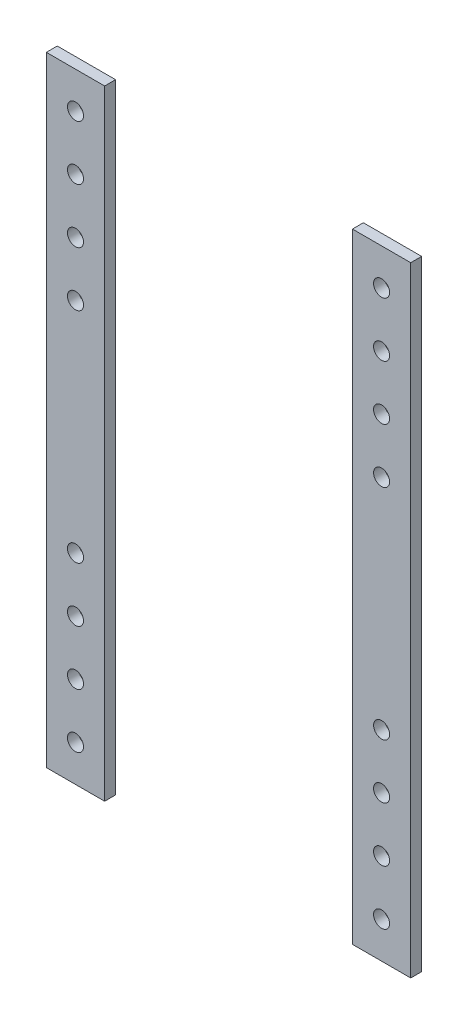
ISO-10303-21;
HEADER;
FILE_DESCRIPTION(('STEP AP214'),'2;1');
FILE_NAME('part.step','',(''),(''),'','','');
FILE_SCHEMA(('AUTOMOTIVE_DESIGN { 1 0 10303 214 1 1 1 1 }'));
ENDSEC;
DATA;
#1=APPLICATION_CONTEXT('core data for automotive mechanical design processes');
#2=APPLICATION_PROTOCOL_DEFINITION('international standard','automotive_design',2000,#1);
#3=PRODUCT_CONTEXT('',#1,'mechanical');
#4=PRODUCT('Part','Part','',(#3));
#5=PRODUCT_RELATED_PRODUCT_CATEGORY('part','',(#4));
#6=PRODUCT_DEFINITION_FORMATION('','',#4);
#7=PRODUCT_DEFINITION_CONTEXT('part definition',#1,'design');
#8=PRODUCT_DEFINITION('design','',#6,#7);
#9=PRODUCT_DEFINITION_SHAPE('','',#8);
#10=(LENGTH_UNIT() NAMED_UNIT(*) SI_UNIT(.MILLI.,.METRE.));
#11=(NAMED_UNIT(*) PLANE_ANGLE_UNIT() SI_UNIT($,.RADIAN.));
#12=(NAMED_UNIT(*) SI_UNIT($,.STERADIAN.) SOLID_ANGLE_UNIT());
#13=UNCERTAINTY_MEASURE_WITH_UNIT(LENGTH_MEASURE(1.E-05),#10,'distance_accuracy_value','');
#14=(GEOMETRIC_REPRESENTATION_CONTEXT(3) GLOBAL_UNCERTAINTY_ASSIGNED_CONTEXT((#13)) GLOBAL_UNIT_ASSIGNED_CONTEXT((#10,
#11,#12)) REPRESENTATION_CONTEXT('',''));
#15=CARTESIAN_POINT('',(0.,0.,0.));
#16=DIRECTION('',(0.,0.,1.));
#17=DIRECTION('',(1.,0.,0.));
#18=AXIS2_PLACEMENT_3D('',#15,#16,#17);
#19=CARTESIAN_POINT('',(0.,0.,-1589.05000079646));
#20=DIRECTION('',(0.,0.,-1.));
#21=DIRECTION('',(-1.,0.,0.));
#22=AXIS2_PLACEMENT_3D('',#19,#20,#21);
#23=PLANE('',#22);
#24=CARTESIAN_POINT('',(42.,760.,-1589.05000079646));
#25=DIRECTION('',(0.,0.,1.));
#26=DIRECTION('',(1.,0.,0.));
#27=AXIS2_PLACEMENT_3D('',#24,#25,#26);
#28=CIRCLE('',#27,2.19999999999997);
#29=CARTESIAN_POINT('',(44.2,760.,-1589.05000079646));
#30=VERTEX_POINT('',#29);
#31=EDGE_CURVE('E411',#30,#30,#28,.T.);
#32=ORIENTED_EDGE('',*,*,#31,.F.);
#33=EDGE_LOOP('',(#32));
#34=FACE_BOUND('',#33,.T.);
#35=CARTESIAN_POINT('',(42.,820.,-1589.05000079646));
#36=DIRECTION('',(0.,0.,1.));
#37=DIRECTION('',(1.,0.,0.));
#38=AXIS2_PLACEMENT_3D('',#35,#36,#37);
#39=CIRCLE('',#38,2.19999999999997);
#40=CARTESIAN_POINT('',(44.2,820.,-1589.05000079646));
#41=VERTEX_POINT('',#40);
#42=EDGE_CURVE('E415',#41,#41,#39,.T.);
#43=ORIENTED_EDGE('',*,*,#42,.F.);
#44=EDGE_LOOP('',(#43));
#45=FACE_BOUND('',#44,.T.);
#46=CARTESIAN_POINT('',(42.,865.,-1589.05000079646));
#47=DIRECTION('',(0.,0.,1.));
#48=DIRECTION('',(1.,0.,0.));
#49=AXIS2_PLACEMENT_3D('',#46,#47,#48);
#50=CIRCLE('',#49,2.19999999999996);
#51=CARTESIAN_POINT('',(44.2,865.,-1589.05000079646));
#52=VERTEX_POINT('',#51);
#53=EDGE_CURVE('E424',#52,#52,#50,.T.);
#54=ORIENTED_EDGE('',*,*,#53,.F.);
#55=EDGE_LOOP('',(#54));
#56=FACE_BOUND('',#55,.T.);
#57=CARTESIAN_POINT('',(42.,850.,-1589.05000079646));
#58=DIRECTION('',(0.,0.,1.));
#59=DIRECTION('',(1.,0.,0.));
#60=AXIS2_PLACEMENT_3D('',#57,#58,#59);
#61=CIRCLE('',#60,2.19999999999996);
#62=CARTESIAN_POINT('',(44.2,850.,-1589.05000079646));
#63=VERTEX_POINT('',#62);
#64=EDGE_CURVE('E430',#63,#63,#61,.T.);
#65=ORIENTED_EDGE('',*,*,#64,.F.);
#66=EDGE_LOOP('',(#65));
#67=FACE_BOUND('',#66,.T.);
#68=CARTESIAN_POINT('',(42.,835.,-1589.05000079646));
#69=DIRECTION('',(0.,0.,1.));
#70=DIRECTION('',(1.,0.,0.));
#71=AXIS2_PLACEMENT_3D('',#68,#69,#70);
#72=CIRCLE('',#71,2.19999999999996);
#73=CARTESIAN_POINT('',(44.2,835.,-1589.05000079646));
#74=VERTEX_POINT('',#73);
#75=EDGE_CURVE('E436',#74,#74,#72,.T.);
#76=ORIENTED_EDGE('',*,*,#75,.F.);
#77=EDGE_LOOP('',(#76));
#78=FACE_BOUND('',#77,.T.);
#79=CARTESIAN_POINT('',(42.,745.,-1589.05000079646));
#80=DIRECTION('',(0.,0.,1.));
#81=DIRECTION('',(1.,0.,0.));
#82=AXIS2_PLACEMENT_3D('',#79,#80,#81);
#83=CIRCLE('',#82,2.19999999999996);
#84=CARTESIAN_POINT('',(44.2,745.,-1589.05000079646));
#85=VERTEX_POINT('',#84);
#86=EDGE_CURVE('E442',#85,#85,#83,.T.);
#87=ORIENTED_EDGE('',*,*,#86,.F.);
#88=EDGE_LOOP('',(#87));
#89=FACE_BOUND('',#88,.T.);
#90=CARTESIAN_POINT('',(42.,730.,-1589.05000079646));
#91=DIRECTION('',(0.,0.,1.));
#92=DIRECTION('',(1.,0.,0.));
#93=AXIS2_PLACEMENT_3D('',#90,#91,#92);
#94=CIRCLE('',#93,2.19999999999996);
#95=CARTESIAN_POINT('',(44.2,730.,-1589.05000079646));
#96=VERTEX_POINT('',#95);
#97=EDGE_CURVE('E448',#96,#96,#94,.T.);
#98=ORIENTED_EDGE('',*,*,#97,.F.);
#99=EDGE_LOOP('',(#98));
#100=FACE_BOUND('',#99,.T.);
#101=CARTESIAN_POINT('',(42.,715.,-1589.05000079646));
#102=DIRECTION('',(0.,0.,1.));
#103=DIRECTION('',(1.,0.,0.));
#104=AXIS2_PLACEMENT_3D('',#101,#102,#103);
#105=CIRCLE('',#104,2.19999999999996);
#106=CARTESIAN_POINT('',(44.2,715.,-1589.05000079646));
#107=VERTEX_POINT('',#106);
#108=EDGE_CURVE('E309',#107,#107,#105,.T.);
#109=ORIENTED_EDGE('',*,*,#108,.F.);
#110=EDGE_LOOP('',(#109));
#111=FACE_BOUND('',#110,.T.);
#112=DIRECTION('',(-1.,0.,0.));
#113=VECTOR('',#112,1.);
#114=CARTESIAN_POINT('',(50.,875.,-1589.05000079646));
#115=LINE('',#114,#113);
#116=CARTESIAN_POINT('',(50.,875.,-1589.05000079646));
#117=VERTEX_POINT('',#116);
#118=CARTESIAN_POINT('',(34.,875.,-1589.05000079646));
#119=VERTEX_POINT('',#118);
#120=EDGE_CURVE('E262',#117,#119,#115,.T.);
#121=ORIENTED_EDGE('',*,*,#120,.T.);
#122=DIRECTION('',(0.,-1.,0.));
#123=VECTOR('',#122,1.);
#124=CARTESIAN_POINT('',(34.,875.,-1589.05000079646));
#125=LINE('',#124,#123);
#126=CARTESIAN_POINT('',(34.,705.,-1589.05000079646));
#127=VERTEX_POINT('',#126);
#128=EDGE_CURVE('E319',#119,#127,#125,.T.);
#129=ORIENTED_EDGE('',*,*,#128,.T.);
#130=DIRECTION('',(-1.,0.,0.));
#131=VECTOR('',#130,1.);
#132=CARTESIAN_POINT('',(50.,705.,-1589.05000079646));
#133=LINE('',#132,#131);
#134=CARTESIAN_POINT('',(50.,705.,-1589.05000079646));
#135=VERTEX_POINT('',#134);
#136=EDGE_CURVE('E308',#135,#127,#133,.T.);
#137=ORIENTED_EDGE('',*,*,#136,.F.);
#138=DIRECTION('',(0.,-1.,0.));
#139=VECTOR('',#138,1.);
#140=CARTESIAN_POINT('',(50.,875.,-1589.05000079646));
#141=LINE('',#140,#139);
#142=EDGE_CURVE('E291',#117,#135,#141,.T.);
#143=ORIENTED_EDGE('',*,*,#142,.F.);
#144=EDGE_LOOP('',(#121,#129,#137,#143));
#145=FACE_BOUND('',#144,.T.);
#146=ADVANCED_FACE('F253',(#34,#45,#56,#67,#78,#89,#100,#111,#145),#23,.F.);
#147=CARTESIAN_POINT('',(0.,0.,-1592.05000079646));
#148=DIRECTION('',(0.,0.,-1.));
#149=DIRECTION('',(-1.,0.,0.));
#150=AXIS2_PLACEMENT_3D('',#147,#148,#149);
#151=PLANE('',#150);
#152=CARTESIAN_POINT('',(42.,760.,-1592.05000079646));
#153=DIRECTION('',(0.,0.,1.));
#154=DIRECTION('',(1.,0.,0.));
#155=AXIS2_PLACEMENT_3D('',#152,#153,#154);
#156=CIRCLE('',#155,2.19999999999997);
#157=CARTESIAN_POINT('',(44.2,760.,-1592.05000079646));
#158=VERTEX_POINT('',#157);
#159=EDGE_CURVE('E408',#158,#158,#156,.T.);
#160=ORIENTED_EDGE('',*,*,#159,.T.);
#161=EDGE_LOOP('',(#160));
#162=FACE_BOUND('',#161,.T.);
#163=CARTESIAN_POINT('',(42.,820.,-1592.05000079646));
#164=DIRECTION('',(0.,0.,1.));
#165=DIRECTION('',(1.,0.,0.));
#166=AXIS2_PLACEMENT_3D('',#163,#164,#165);
#167=CIRCLE('',#166,2.19999999999997);
#168=CARTESIAN_POINT('',(44.2,820.,-1592.05000079646));
#169=VERTEX_POINT('',#168);
#170=EDGE_CURVE('E412',#169,#169,#167,.T.);
#171=ORIENTED_EDGE('',*,*,#170,.T.);
#172=EDGE_LOOP('',(#171));
#173=FACE_BOUND('',#172,.T.);
#174=CARTESIAN_POINT('',(42.,865.,-1592.05000079646));
#175=DIRECTION('',(0.,0.,1.));
#176=DIRECTION('',(1.,0.,0.));
#177=AXIS2_PLACEMENT_3D('',#174,#175,#176);
#178=CIRCLE('',#177,2.19999999999996);
#179=CARTESIAN_POINT('',(44.2,865.,-1592.05000079646));
#180=VERTEX_POINT('',#179);
#181=EDGE_CURVE('E421',#180,#180,#178,.T.);
#182=ORIENTED_EDGE('',*,*,#181,.T.);
#183=EDGE_LOOP('',(#182));
#184=FACE_BOUND('',#183,.T.);
#185=CARTESIAN_POINT('',(42.,850.,-1592.05000079646));
#186=DIRECTION('',(0.,0.,1.));
#187=DIRECTION('',(1.,0.,0.));
#188=AXIS2_PLACEMENT_3D('',#185,#186,#187);
#189=CIRCLE('',#188,2.19999999999996);
#190=CARTESIAN_POINT('',(44.2,850.,-1592.05000079646));
#191=VERTEX_POINT('',#190);
#192=EDGE_CURVE('E427',#191,#191,#189,.T.);
#193=ORIENTED_EDGE('',*,*,#192,.T.);
#194=EDGE_LOOP('',(#193));
#195=FACE_BOUND('',#194,.T.);
#196=CARTESIAN_POINT('',(42.,835.,-1592.05000079646));
#197=DIRECTION('',(0.,0.,1.));
#198=DIRECTION('',(1.,0.,0.));
#199=AXIS2_PLACEMENT_3D('',#196,#197,#198);
#200=CIRCLE('',#199,2.19999999999996);
#201=CARTESIAN_POINT('',(44.2,835.,-1592.05000079646));
#202=VERTEX_POINT('',#201);
#203=EDGE_CURVE('E433',#202,#202,#200,.T.);
#204=ORIENTED_EDGE('',*,*,#203,.T.);
#205=EDGE_LOOP('',(#204));
#206=FACE_BOUND('',#205,.T.);
#207=CARTESIAN_POINT('',(42.,745.,-1592.05000079646));
#208=DIRECTION('',(0.,0.,1.));
#209=DIRECTION('',(1.,0.,0.));
#210=AXIS2_PLACEMENT_3D('',#207,#208,#209);
#211=CIRCLE('',#210,2.19999999999996);
#212=CARTESIAN_POINT('',(44.2,745.,-1592.05000079646));
#213=VERTEX_POINT('',#212);
#214=EDGE_CURVE('E439',#213,#213,#211,.T.);
#215=ORIENTED_EDGE('',*,*,#214,.T.);
#216=EDGE_LOOP('',(#215));
#217=FACE_BOUND('',#216,.T.);
#218=CARTESIAN_POINT('',(42.,730.,-1592.05000079646));
#219=DIRECTION('',(0.,0.,1.));
#220=DIRECTION('',(1.,0.,0.));
#221=AXIS2_PLACEMENT_3D('',#218,#219,#220);
#222=CIRCLE('',#221,2.19999999999996);
#223=CARTESIAN_POINT('',(44.2,730.,-1592.05000079646));
#224=VERTEX_POINT('',#223);
#225=EDGE_CURVE('E445',#224,#224,#222,.T.);
#226=ORIENTED_EDGE('',*,*,#225,.T.);
#227=EDGE_LOOP('',(#226));
#228=FACE_BOUND('',#227,.T.);
#229=CARTESIAN_POINT('',(42.,715.,-1592.05000079646));
#230=DIRECTION('',(0.,0.,1.));
#231=DIRECTION('',(1.,0.,0.));
#232=AXIS2_PLACEMENT_3D('',#229,#230,#231);
#233=CIRCLE('',#232,2.19999999999996);
#234=CARTESIAN_POINT('',(44.2,715.,-1592.05000079646));
#235=VERTEX_POINT('',#234);
#236=EDGE_CURVE('E312',#235,#235,#233,.T.);
#237=ORIENTED_EDGE('',*,*,#236,.T.);
#238=EDGE_LOOP('',(#237));
#239=FACE_BOUND('',#238,.T.);
#240=DIRECTION('',(-1.,0.,0.));
#241=VECTOR('',#240,1.);
#242=CARTESIAN_POINT('',(50.,875.,-1592.05000079646));
#243=LINE('',#242,#241);
#244=CARTESIAN_POINT('',(50.,875.,-1592.05000079646));
#245=VERTEX_POINT('',#244);
#246=CARTESIAN_POINT('',(34.,875.,-1592.05000079646));
#247=VERTEX_POINT('',#246);
#248=EDGE_CURVE('E13',#245,#247,#243,.T.);
#249=ORIENTED_EDGE('',*,*,#248,.F.);
#250=DIRECTION('',(0.,-1.,0.));
#251=VECTOR('',#250,1.);
#252=CARTESIAN_POINT('',(50.,875.,-1592.05000079646));
#253=LINE('',#252,#251);
#254=CARTESIAN_POINT('',(50.,705.,-1592.05000079646));
#255=VERTEX_POINT('',#254);
#256=EDGE_CURVE('E305',#245,#255,#253,.T.);
#257=ORIENTED_EDGE('',*,*,#256,.T.);
#258=DIRECTION('',(-1.,0.,0.));
#259=VECTOR('',#258,1.);
#260=CARTESIAN_POINT('',(50.,705.,-1592.05000079646));
#261=LINE('',#260,#259);
#262=CARTESIAN_POINT('',(34.,705.,-1592.05000079646));
#263=VERTEX_POINT('',#262);
#264=EDGE_CURVE('E326',#255,#263,#261,.T.);
#265=ORIENTED_EDGE('',*,*,#264,.T.);
#266=DIRECTION('',(0.,-1.,0.));
#267=VECTOR('',#266,1.);
#268=CARTESIAN_POINT('',(34.,875.,-1592.05000079646));
#269=LINE('',#268,#267);
#270=EDGE_CURVE('E301',#247,#263,#269,.T.);
#271=ORIENTED_EDGE('',*,*,#270,.F.);
#272=EDGE_LOOP('',(#249,#257,#265,#271));
#273=FACE_BOUND('',#272,.T.);
#274=ADVANCED_FACE('F353',(#162,#173,#184,#195,#206,#217,#228,#239,#273),#151,.T.);
#275=CARTESIAN_POINT('',(50.,875.,-1592.05000079646));
#276=DIRECTION('',(-1.,0.,0.));
#277=DIRECTION('',(0.,0.,1.));
#278=AXIS2_PLACEMENT_3D('',#275,#276,#277);
#279=PLANE('',#278);
#280=ORIENTED_EDGE('',*,*,#142,.T.);
#281=DIRECTION('',(0.,0.,1.));
#282=VECTOR('',#281,1.);
#283=CARTESIAN_POINT('',(50.,705.,-1592.05000079646));
#284=LINE('',#283,#282);
#285=EDGE_CURVE('E334',#255,#135,#284,.T.);
#286=ORIENTED_EDGE('',*,*,#285,.F.);
#287=ORIENTED_EDGE('',*,*,#256,.F.);
#288=DIRECTION('',(0.,0.,1.));
#289=VECTOR('',#288,1.);
#290=CARTESIAN_POINT('',(50.,875.,-1592.05000079646));
#291=LINE('',#290,#289);
#292=EDGE_CURVE('E296',#245,#117,#291,.T.);
#293=ORIENTED_EDGE('',*,*,#292,.T.);
#294=EDGE_LOOP('',(#280,#286,#287,#293));
#295=FACE_BOUND('',#294,.T.);
#296=ADVANCED_FACE('F303',(#295),#279,.F.);
#297=CARTESIAN_POINT('',(50.,705.,-1592.05000079646));
#298=DIRECTION('',(0.,1.,0.));
#299=DIRECTION('',(0.,0.,1.));
#300=AXIS2_PLACEMENT_3D('',#297,#298,#299);
#301=PLANE('',#300);
#302=ORIENTED_EDGE('',*,*,#136,.T.);
#303=DIRECTION('',(0.,0.,1.));
#304=VECTOR('',#303,1.);
#305=CARTESIAN_POINT('',(34.,705.,-1592.05000079646));
#306=LINE('',#305,#304);
#307=EDGE_CURVE('E321',#263,#127,#306,.T.);
#308=ORIENTED_EDGE('',*,*,#307,.F.);
#309=ORIENTED_EDGE('',*,*,#264,.F.);
#310=ORIENTED_EDGE('',*,*,#285,.T.);
#311=EDGE_LOOP('',(#302,#308,#309,#310));
#312=FACE_BOUND('',#311,.T.);
#313=ADVANCED_FACE('F352',(#312),#301,.F.);
#314=CARTESIAN_POINT('',(50.,875.,-1592.05000079646));
#315=DIRECTION('',(0.,1.,0.));
#316=DIRECTION('',(0.,0.,1.));
#317=AXIS2_PLACEMENT_3D('',#314,#315,#316);
#318=PLANE('',#317);
#319=ORIENTED_EDGE('',*,*,#120,.F.);
#320=ORIENTED_EDGE('',*,*,#292,.F.);
#321=ORIENTED_EDGE('',*,*,#248,.T.);
#322=DIRECTION('',(0.,0.,1.));
#323=VECTOR('',#322,1.);
#324=CARTESIAN_POINT('',(34.,875.,-1592.05000079646));
#325=LINE('',#324,#323);
#326=EDGE_CURVE('E298',#247,#119,#325,.T.);
#327=ORIENTED_EDGE('',*,*,#326,.T.);
#328=EDGE_LOOP('',(#319,#320,#321,#327));
#329=FACE_BOUND('',#328,.T.);
#330=ADVANCED_FACE('F295',(#329),#318,.T.);
#331=CARTESIAN_POINT('',(34.,875.,-1592.05000079646));
#332=DIRECTION('',(-1.,0.,0.));
#333=DIRECTION('',(0.,-1.,0.));
#334=AXIS2_PLACEMENT_3D('',#331,#332,#333);
#335=PLANE('',#334);
#336=ORIENTED_EDGE('',*,*,#128,.F.);
#337=ORIENTED_EDGE('',*,*,#326,.F.);
#338=ORIENTED_EDGE('',*,*,#270,.T.);
#339=ORIENTED_EDGE('',*,*,#307,.T.);
#340=EDGE_LOOP('',(#336,#337,#338,#339));
#341=FACE_BOUND('',#340,.T.);
#342=ADVANCED_FACE('F351',(#341),#335,.T.);
#343=CARTESIAN_POINT('',(42.,715.,-1592.05000079646));
#344=DIRECTION('',(0.,0.,1.));
#345=DIRECTION('',(1.,0.,0.));
#346=AXIS2_PLACEMENT_3D('',#343,#344,#345);
#347=CYLINDRICAL_SURFACE('',#346,2.19999999999996);
#348=ORIENTED_EDGE('',*,*,#236,.F.);
#349=EDGE_LOOP('',(#348));
#350=FACE_BOUND('',#349,.T.);
#351=ORIENTED_EDGE('',*,*,#108,.T.);
#352=EDGE_LOOP('',(#351));
#353=FACE_BOUND('',#352,.T.);
#354=ADVANCED_FACE('F362',(#350,#353),#347,.F.);
#355=CARTESIAN_POINT('',(42.,730.,-1592.05000079646));
#356=DIRECTION('',(0.,0.,1.));
#357=DIRECTION('',(1.,0.,0.));
#358=AXIS2_PLACEMENT_3D('',#355,#356,#357);
#359=CYLINDRICAL_SURFACE('',#358,2.19999999999996);
#360=ORIENTED_EDGE('',*,*,#225,.F.);
#361=EDGE_LOOP('',(#360));
#362=FACE_BOUND('',#361,.T.);
#363=ORIENTED_EDGE('',*,*,#97,.T.);
#364=EDGE_LOOP('',(#363));
#365=FACE_BOUND('',#364,.T.);
#366=ADVANCED_FACE('F372',(#362,#365),#359,.F.);
#367=CARTESIAN_POINT('',(42.,745.,-1592.05000079646));
#368=DIRECTION('',(0.,0.,1.));
#369=DIRECTION('',(1.,0.,0.));
#370=AXIS2_PLACEMENT_3D('',#367,#368,#369);
#371=CYLINDRICAL_SURFACE('',#370,2.19999999999996);
#372=ORIENTED_EDGE('',*,*,#214,.F.);
#373=EDGE_LOOP('',(#372));
#374=FACE_BOUND('',#373,.T.);
#375=ORIENTED_EDGE('',*,*,#86,.T.);
#376=EDGE_LOOP('',(#375));
#377=FACE_BOUND('',#376,.T.);
#378=ADVANCED_FACE('F380',(#374,#377),#371,.F.);
#379=CARTESIAN_POINT('',(42.,835.,-1592.05000079646));
#380=DIRECTION('',(0.,0.,1.));
#381=DIRECTION('',(1.,0.,0.));
#382=AXIS2_PLACEMENT_3D('',#379,#380,#381);
#383=CYLINDRICAL_SURFACE('',#382,2.19999999999996);
#384=ORIENTED_EDGE('',*,*,#203,.F.);
#385=EDGE_LOOP('',(#384));
#386=FACE_BOUND('',#385,.T.);
#387=ORIENTED_EDGE('',*,*,#75,.T.);
#388=EDGE_LOOP('',(#387));
#389=FACE_BOUND('',#388,.T.);
#390=ADVANCED_FACE('F384',(#386,#389),#383,.F.);
#391=CARTESIAN_POINT('',(42.,850.,-1592.05000079646));
#392=DIRECTION('',(0.,0.,1.));
#393=DIRECTION('',(1.,0.,0.));
#394=AXIS2_PLACEMENT_3D('',#391,#392,#393);
#395=CYLINDRICAL_SURFACE('',#394,2.19999999999996);
#396=ORIENTED_EDGE('',*,*,#192,.F.);
#397=EDGE_LOOP('',(#396));
#398=FACE_BOUND('',#397,.T.);
#399=ORIENTED_EDGE('',*,*,#64,.T.);
#400=EDGE_LOOP('',(#399));
#401=FACE_BOUND('',#400,.T.);
#402=ADVANCED_FACE('F388',(#398,#401),#395,.F.);
#403=CARTESIAN_POINT('',(42.,865.,-1592.05000079646));
#404=DIRECTION('',(0.,0.,1.));
#405=DIRECTION('',(1.,0.,0.));
#406=AXIS2_PLACEMENT_3D('',#403,#404,#405);
#407=CYLINDRICAL_SURFACE('',#406,2.19999999999996);
#408=ORIENTED_EDGE('',*,*,#181,.F.);
#409=EDGE_LOOP('',(#408));
#410=FACE_BOUND('',#409,.T.);
#411=ORIENTED_EDGE('',*,*,#53,.T.);
#412=EDGE_LOOP('',(#411));
#413=FACE_BOUND('',#412,.T.);
#414=ADVANCED_FACE('F392',(#410,#413),#407,.F.);
#415=CARTESIAN_POINT('',(42.,820.,-1592.05000079646));
#416=DIRECTION('',(0.,0.,1.));
#417=DIRECTION('',(1.,0.,0.));
#418=AXIS2_PLACEMENT_3D('',#415,#416,#417);
#419=CYLINDRICAL_SURFACE('',#418,2.19999999999997);
#420=ORIENTED_EDGE('',*,*,#170,.F.);
#421=EDGE_LOOP('',(#420));
#422=FACE_BOUND('',#421,.T.);
#423=ORIENTED_EDGE('',*,*,#42,.T.);
#424=EDGE_LOOP('',(#423));
#425=FACE_BOUND('',#424,.T.);
#426=ADVANCED_FACE('F396',(#422,#425),#419,.F.);
#427=CARTESIAN_POINT('',(42.,760.,-1592.05000079646));
#428=DIRECTION('',(0.,0.,1.));
#429=DIRECTION('',(1.,0.,0.));
#430=AXIS2_PLACEMENT_3D('',#427,#428,#429);
#431=CYLINDRICAL_SURFACE('',#430,2.19999999999997);
#432=ORIENTED_EDGE('',*,*,#159,.F.);
#433=EDGE_LOOP('',(#432));
#434=FACE_BOUND('',#433,.T.);
#435=ORIENTED_EDGE('',*,*,#31,.T.);
#436=EDGE_LOOP('',(#435));
#437=FACE_BOUND('',#436,.T.);
#438=ADVANCED_FACE('F400',(#434,#437),#431,.F.);
#439=CLOSED_SHELL('',(#146,#274,#296,#313,#330,#342,#354,#366,#378,#390,#402,#414,#426,#438));
#440=MANIFOLD_SOLID_BREP('B2',#439);
#441=CARTESIAN_POINT('',(0.,0.,-1589.05000079646));
#442=DIRECTION('',(0.,0.,-1.));
#443=DIRECTION('',(-1.,0.,0.));
#444=AXIS2_PLACEMENT_3D('',#441,#442,#443);
#445=PLANE('',#444);
#446=CARTESIAN_POINT('',(-42.,820.,-1589.05000079646));
#447=DIRECTION('',(0.,0.,1.));
#448=DIRECTION('',(1.,0.,0.));
#449=AXIS2_PLACEMENT_3D('',#446,#447,#448);
#450=CIRCLE('',#449,2.19999999999997);
#451=CARTESIAN_POINT('',(-39.8,820.,-1589.05000079646));
#452=VERTEX_POINT('',#451);
#453=EDGE_CURVE('E708',#452,#452,#450,.T.);
#454=ORIENTED_EDGE('',*,*,#453,.F.);
#455=EDGE_LOOP('',(#454));
#456=FACE_BOUND('',#455,.T.);
#457=CARTESIAN_POINT('',(-42.,760.,-1589.05000079646));
#458=DIRECTION('',(0.,0.,1.));
#459=DIRECTION('',(1.,0.,0.));
#460=AXIS2_PLACEMENT_3D('',#457,#458,#459);
#461=CIRCLE('',#460,2.19999999999997);
#462=CARTESIAN_POINT('',(-39.8000000000001,760.,-1589.05000079646));
#463=VERTEX_POINT('',#462);
#464=EDGE_CURVE('E702',#463,#463,#461,.T.);
#465=ORIENTED_EDGE('',*,*,#464,.F.);
#466=EDGE_LOOP('',(#465));
#467=FACE_BOUND('',#466,.T.);
#468=CARTESIAN_POINT('',(-42.,715.,-1589.05000079646));
#469=DIRECTION('',(0.,0.,1.));
#470=DIRECTION('',(1.,0.,0.));
#471=AXIS2_PLACEMENT_3D('',#468,#469,#470);
#472=CIRCLE('',#471,2.19999999999996);
#473=CARTESIAN_POINT('',(-39.8000000000001,715.,-1589.05000079646));
#474=VERTEX_POINT('',#473);
#475=EDGE_CURVE('E696',#474,#474,#472,.T.);
#476=ORIENTED_EDGE('',*,*,#475,.F.);
#477=EDGE_LOOP('',(#476));
#478=FACE_BOUND('',#477,.T.);
#479=CARTESIAN_POINT('',(-42.,730.,-1589.05000079646));
#480=DIRECTION('',(0.,0.,1.));
#481=DIRECTION('',(1.,0.,0.));
#482=AXIS2_PLACEMENT_3D('',#479,#480,#481);
#483=CIRCLE('',#482,2.19999999999996);
#484=CARTESIAN_POINT('',(-39.8000000000001,730.,-1589.05000079646));
#485=VERTEX_POINT('',#484);
#486=EDGE_CURVE('E690',#485,#485,#483,.T.);
#487=ORIENTED_EDGE('',*,*,#486,.F.);
#488=EDGE_LOOP('',(#487));
#489=FACE_BOUND('',#488,.T.);
#490=CARTESIAN_POINT('',(-42.,745.,-1589.05000079646));
#491=DIRECTION('',(0.,0.,1.));
#492=DIRECTION('',(1.,0.,0.));
#493=AXIS2_PLACEMENT_3D('',#490,#491,#492);
#494=CIRCLE('',#493,2.19999999999996);
#495=CARTESIAN_POINT('',(-39.8000000000001,745.,-1589.05000079646));
#496=VERTEX_POINT('',#495);
#497=EDGE_CURVE('E684',#496,#496,#494,.T.);
#498=ORIENTED_EDGE('',*,*,#497,.F.);
#499=EDGE_LOOP('',(#498));
#500=FACE_BOUND('',#499,.T.);
#501=CARTESIAN_POINT('',(-42.,835.,-1589.05000079646));
#502=DIRECTION('',(0.,0.,1.));
#503=DIRECTION('',(1.,0.,0.));
#504=AXIS2_PLACEMENT_3D('',#501,#502,#503);
#505=CIRCLE('',#504,2.19999999999996);
#506=CARTESIAN_POINT('',(-39.8000000000001,835.,-1589.05000079646));
#507=VERTEX_POINT('',#506);
#508=EDGE_CURVE('E678',#507,#507,#505,.T.);
#509=ORIENTED_EDGE('',*,*,#508,.F.);
#510=EDGE_LOOP('',(#509));
#511=FACE_BOUND('',#510,.T.);
#512=CARTESIAN_POINT('',(-42.,850.,-1589.05000079646));
#513=DIRECTION('',(0.,0.,1.));
#514=DIRECTION('',(1.,0.,0.));
#515=AXIS2_PLACEMENT_3D('',#512,#513,#514);
#516=CIRCLE('',#515,2.19999999999996);
#517=CARTESIAN_POINT('',(-39.8000000000001,850.,-1589.05000079646));
#518=VERTEX_POINT('',#517);
#519=EDGE_CURVE('E672',#518,#518,#516,.T.);
#520=ORIENTED_EDGE('',*,*,#519,.F.);
#521=EDGE_LOOP('',(#520));
#522=FACE_BOUND('',#521,.T.);
#523=CARTESIAN_POINT('',(-42.,865.,-1589.05000079646));
#524=DIRECTION('',(0.,0.,1.));
#525=DIRECTION('',(1.,0.,0.));
#526=AXIS2_PLACEMENT_3D('',#523,#524,#525);
#527=CIRCLE('',#526,2.19999999999996);
#528=CARTESIAN_POINT('',(-39.8000000000001,865.,-1589.05000079646));
#529=VERTEX_POINT('',#528);
#530=EDGE_CURVE('E641',#529,#529,#527,.T.);
#531=ORIENTED_EDGE('',*,*,#530,.F.);
#532=EDGE_LOOP('',(#531));
#533=FACE_BOUND('',#532,.T.);
#534=DIRECTION('',(0.,-1.,0.));
#535=VECTOR('',#534,1.);
#536=CARTESIAN_POINT('',(-50.,875.,-1589.05000079646));
#537=LINE('',#536,#535);
#538=CARTESIAN_POINT('',(-50.,875.,-1589.05000079646));
#539=VERTEX_POINT('',#538);
#540=CARTESIAN_POINT('',(-50.,705.,-1589.05000079646));
#541=VERTEX_POINT('',#540);
#542=EDGE_CURVE('E598',#539,#541,#537,.T.);
#543=ORIENTED_EDGE('',*,*,#542,.T.);
#544=DIRECTION('',(1.,0.,0.));
#545=VECTOR('',#544,1.);
#546=CARTESIAN_POINT('',(-50.,705.,-1589.05000079646));
#547=LINE('',#546,#545);
#548=CARTESIAN_POINT('',(-34.,705.,-1589.05000079646));
#549=VERTEX_POINT('',#548);
#550=EDGE_CURVE('E604',#541,#549,#547,.T.);
#551=ORIENTED_EDGE('',*,*,#550,.T.);
#552=DIRECTION('',(0.,-1.,0.));
#553=VECTOR('',#552,1.);
#554=CARTESIAN_POINT('',(-34.,875.,-1589.05000079646));
#555=LINE('',#554,#553);
#556=CARTESIAN_POINT('',(-34.,875.,-1589.05000079646));
#557=VERTEX_POINT('',#556);
#558=EDGE_CURVE('E628',#557,#549,#555,.T.);
#559=ORIENTED_EDGE('',*,*,#558,.F.);
#560=DIRECTION('',(1.,0.,0.));
#561=VECTOR('',#560,1.);
#562=CARTESIAN_POINT('',(-50.,875.,-1589.05000079646));
#563=LINE('',#562,#561);
#564=EDGE_CURVE('E578',#539,#557,#563,.T.);
#565=ORIENTED_EDGE('',*,*,#564,.F.);
#566=EDGE_LOOP('',(#543,#551,#559,#565));
#567=FACE_BOUND('',#566,.T.);
#568=ADVANCED_FACE('F569',(#456,#467,#478,#489,#500,#511,#522,#533,#567),#445,.F.);
#569=CARTESIAN_POINT('',(0.,0.,-1592.05000079646));
#570=DIRECTION('',(0.,0.,-1.));
#571=DIRECTION('',(-1.,0.,0.));
#572=AXIS2_PLACEMENT_3D('',#569,#570,#571);
#573=PLANE('',#572);
#574=CARTESIAN_POINT('',(-42.,820.,-1592.05000079646));
#575=DIRECTION('',(0.,0.,1.));
#576=DIRECTION('',(1.,0.,0.));
#577=AXIS2_PLACEMENT_3D('',#574,#575,#576);
#578=CIRCLE('',#577,2.19999999999997);
#579=CARTESIAN_POINT('',(-39.8,820.,-1592.05000079646));
#580=VERTEX_POINT('',#579);
#581=EDGE_CURVE('E711',#580,#580,#578,.T.);
#582=ORIENTED_EDGE('',*,*,#581,.T.);
#583=EDGE_LOOP('',(#582));
#584=FACE_BOUND('',#583,.T.);
#585=CARTESIAN_POINT('',(-42.,760.,-1592.05000079646));
#586=DIRECTION('',(0.,0.,1.));
#587=DIRECTION('',(1.,0.,0.));
#588=AXIS2_PLACEMENT_3D('',#585,#586,#587);
#589=CIRCLE('',#588,2.19999999999997);
#590=CARTESIAN_POINT('',(-39.8000000000001,760.,-1592.05000079646));
#591=VERTEX_POINT('',#590);
#592=EDGE_CURVE('E705',#591,#591,#589,.T.);
#593=ORIENTED_EDGE('',*,*,#592,.T.);
#594=EDGE_LOOP('',(#593));
#595=FACE_BOUND('',#594,.T.);
#596=CARTESIAN_POINT('',(-42.,715.,-1592.05000079646));
#597=DIRECTION('',(0.,0.,1.));
#598=DIRECTION('',(1.,0.,0.));
#599=AXIS2_PLACEMENT_3D('',#596,#597,#598);
#600=CIRCLE('',#599,2.19999999999996);
#601=CARTESIAN_POINT('',(-39.8000000000001,715.,-1592.05000079646));
#602=VERTEX_POINT('',#601);
#603=EDGE_CURVE('E699',#602,#602,#600,.T.);
#604=ORIENTED_EDGE('',*,*,#603,.T.);
#605=EDGE_LOOP('',(#604));
#606=FACE_BOUND('',#605,.T.);
#607=CARTESIAN_POINT('',(-42.,730.,-1592.05000079646));
#608=DIRECTION('',(0.,0.,1.));
#609=DIRECTION('',(1.,0.,0.));
#610=AXIS2_PLACEMENT_3D('',#607,#608,#609);
#611=CIRCLE('',#610,2.19999999999996);
#612=CARTESIAN_POINT('',(-39.8000000000001,730.,-1592.05000079646));
#613=VERTEX_POINT('',#612);
#614=EDGE_CURVE('E693',#613,#613,#611,.T.);
#615=ORIENTED_EDGE('',*,*,#614,.T.);
#616=EDGE_LOOP('',(#615));
#617=FACE_BOUND('',#616,.T.);
#618=CARTESIAN_POINT('',(-42.,745.,-1592.05000079646));
#619=DIRECTION('',(0.,0.,1.));
#620=DIRECTION('',(1.,0.,0.));
#621=AXIS2_PLACEMENT_3D('',#618,#619,#620);
#622=CIRCLE('',#621,2.19999999999996);
#623=CARTESIAN_POINT('',(-39.8000000000001,745.,-1592.05000079646));
#624=VERTEX_POINT('',#623);
#625=EDGE_CURVE('E687',#624,#624,#622,.T.);
#626=ORIENTED_EDGE('',*,*,#625,.T.);
#627=EDGE_LOOP('',(#626));
#628=FACE_BOUND('',#627,.T.);
#629=CARTESIAN_POINT('',(-42.,835.,-1592.05000079646));
#630=DIRECTION('',(0.,0.,1.));
#631=DIRECTION('',(1.,0.,0.));
#632=AXIS2_PLACEMENT_3D('',#629,#630,#631);
#633=CIRCLE('',#632,2.19999999999996);
#634=CARTESIAN_POINT('',(-39.8000000000001,835.,-1592.05000079646));
#635=VERTEX_POINT('',#634);
#636=EDGE_CURVE('E681',#635,#635,#633,.T.);
#637=ORIENTED_EDGE('',*,*,#636,.T.);
#638=EDGE_LOOP('',(#637));
#639=FACE_BOUND('',#638,.T.);
#640=CARTESIAN_POINT('',(-42.,850.,-1592.05000079646));
#641=DIRECTION('',(0.,0.,1.));
#642=DIRECTION('',(1.,0.,0.));
#643=AXIS2_PLACEMENT_3D('',#640,#641,#642);
#644=CIRCLE('',#643,2.19999999999996);
#645=CARTESIAN_POINT('',(-39.8000000000001,850.,-1592.05000079646));
#646=VERTEX_POINT('',#645);
#647=EDGE_CURVE('E675',#646,#646,#644,.T.);
#648=ORIENTED_EDGE('',*,*,#647,.T.);
#649=EDGE_LOOP('',(#648));
#650=FACE_BOUND('',#649,.T.);
#651=CARTESIAN_POINT('',(-42.,865.,-1592.05000079646));
#652=DIRECTION('',(0.,0.,1.));
#653=DIRECTION('',(1.,0.,0.));
#654=AXIS2_PLACEMENT_3D('',#651,#652,#653);
#655=CIRCLE('',#654,2.19999999999996);
#656=CARTESIAN_POINT('',(-39.8000000000001,865.,-1592.05000079646));
#657=VERTEX_POINT('',#656);
#658=EDGE_CURVE('E669',#657,#657,#655,.T.);
#659=ORIENTED_EDGE('',*,*,#658,.T.);
#660=EDGE_LOOP('',(#659));
#661=FACE_BOUND('',#660,.T.);
#662=DIRECTION('',(0.,-1.,0.));
#663=VECTOR('',#662,1.);
#664=CARTESIAN_POINT('',(-50.,875.,-1592.05000079646));
#665=LINE('',#664,#663);
#666=CARTESIAN_POINT('',(-50.,875.,-1592.05000079646));
#667=VERTEX_POINT('',#666);
#668=CARTESIAN_POINT('',(-50.,705.,-1592.05000079646));
#669=VERTEX_POINT('',#668);
#670=EDGE_CURVE('E586',#667,#669,#665,.T.);
#671=ORIENTED_EDGE('',*,*,#670,.F.);
#672=DIRECTION('',(1.,0.,0.));
#673=VECTOR('',#672,1.);
#674=CARTESIAN_POINT('',(-50.,875.,-1592.05000079646));
#675=LINE('',#674,#673);
#676=CARTESIAN_POINT('',(-34.,875.,-1592.05000079646));
#677=VERTEX_POINT('',#676);
#678=EDGE_CURVE('E251',#667,#677,#675,.T.);
#679=ORIENTED_EDGE('',*,*,#678,.T.);
#680=DIRECTION('',(0.,-1.,0.));
#681=VECTOR('',#680,1.);
#682=CARTESIAN_POINT('',(-34.,875.,-1592.05000079646));
#683=LINE('',#682,#681);
#684=CARTESIAN_POINT('',(-34.,705.,-1592.05000079646));
#685=VERTEX_POINT('',#684);
#686=EDGE_CURVE('E613',#677,#685,#683,.T.);
#687=ORIENTED_EDGE('',*,*,#686,.T.);
#688=DIRECTION('',(1.,0.,0.));
#689=VECTOR('',#688,1.);
#690=CARTESIAN_POINT('',(-50.,705.,-1592.05000079646));
#691=LINE('',#690,#689);
#692=EDGE_CURVE('E647',#669,#685,#691,.T.);
#693=ORIENTED_EDGE('',*,*,#692,.F.);
#694=EDGE_LOOP('',(#671,#679,#687,#693));
#695=FACE_BOUND('',#694,.T.);
#696=ADVANCED_FACE('F612',(#584,#595,#606,#617,#628,#639,#650,#661,#695),#573,.T.);
#697=CARTESIAN_POINT('',(-50.,875.,-1592.05000079646));
#698=DIRECTION('',(-1.,0.,0.));
#699=DIRECTION('',(0.,0.,1.));
#700=AXIS2_PLACEMENT_3D('',#697,#698,#699);
#701=PLANE('',#700);
#702=ORIENTED_EDGE('',*,*,#542,.F.);
#703=DIRECTION('',(0.,0.,1.));
#704=VECTOR('',#703,1.);
#705=CARTESIAN_POINT('',(-50.,875.,-1592.05000079646));
#706=LINE('',#705,#704);
#707=EDGE_CURVE('E640',#667,#539,#706,.T.);
#708=ORIENTED_EDGE('',*,*,#707,.F.);
#709=ORIENTED_EDGE('',*,*,#670,.T.);
#710=DIRECTION('',(0.,0.,1.));
#711=VECTOR('',#710,1.);
#712=CARTESIAN_POINT('',(-50.,705.,-1592.05000079646));
#713=LINE('',#712,#711);
#714=EDGE_CURVE('E654',#669,#541,#713,.T.);
#715=ORIENTED_EDGE('',*,*,#714,.T.);
#716=EDGE_LOOP('',(#702,#708,#709,#715));
#717=FACE_BOUND('',#716,.T.);
#718=ADVANCED_FACE('F756',(#717),#701,.T.);
#719=CARTESIAN_POINT('',(-50.,705.,-1592.05000079646));
#720=DIRECTION('',(0.,-1.,0.));
#721=DIRECTION('',(0.,0.,-1.));
#722=AXIS2_PLACEMENT_3D('',#719,#720,#721);
#723=PLANE('',#722);
#724=ORIENTED_EDGE('',*,*,#550,.F.);
#725=ORIENTED_EDGE('',*,*,#714,.F.);
#726=ORIENTED_EDGE('',*,*,#692,.T.);
#727=DIRECTION('',(0.,0.,1.));
#728=VECTOR('',#727,1.);
#729=CARTESIAN_POINT('',(-34.,705.,-1592.05000079646));
#730=LINE('',#729,#728);
#731=EDGE_CURVE('E624',#685,#549,#730,.T.);
#732=ORIENTED_EDGE('',*,*,#731,.T.);
#733=EDGE_LOOP('',(#724,#725,#726,#732));
#734=FACE_BOUND('',#733,.T.);
#735=ADVANCED_FACE('F759',(#734),#723,.T.);
#736=CARTESIAN_POINT('',(-50.,875.,-1592.05000079646));
#737=DIRECTION('',(0.,-1.,0.));
#738=DIRECTION('',(0.,0.,-1.));
#739=AXIS2_PLACEMENT_3D('',#736,#737,#738);
#740=PLANE('',#739);
#741=ORIENTED_EDGE('',*,*,#564,.T.);
#742=DIRECTION('',(0.,0.,1.));
#743=VECTOR('',#742,1.);
#744=CARTESIAN_POINT('',(-34.,875.,-1592.05000079646));
#745=LINE('',#744,#743);
#746=EDGE_CURVE('E622',#677,#557,#745,.T.);
#747=ORIENTED_EDGE('',*,*,#746,.F.);
#748=ORIENTED_EDGE('',*,*,#678,.F.);
#749=ORIENTED_EDGE('',*,*,#707,.T.);
#750=EDGE_LOOP('',(#741,#747,#748,#749));
#751=FACE_BOUND('',#750,.T.);
#752=ADVANCED_FACE('F627',(#751),#740,.F.);
#753=CARTESIAN_POINT('',(-34.,875.,-1592.05000079646));
#754=DIRECTION('',(-1.,0.,0.));
#755=DIRECTION('',(0.,-1.,0.));
#756=AXIS2_PLACEMENT_3D('',#753,#754,#755);
#757=PLANE('',#756);
#758=ORIENTED_EDGE('',*,*,#558,.T.);
#759=ORIENTED_EDGE('',*,*,#731,.F.);
#760=ORIENTED_EDGE('',*,*,#686,.F.);
#761=ORIENTED_EDGE('',*,*,#746,.T.);
#762=EDGE_LOOP('',(#758,#759,#760,#761));
#763=FACE_BOUND('',#762,.T.);
#764=ADVANCED_FACE('F621',(#763),#757,.F.);
#765=CARTESIAN_POINT('',(-42.,865.,-1592.05000079646));
#766=DIRECTION('',(0.,0.,1.));
#767=DIRECTION('',(1.,0.,0.));
#768=AXIS2_PLACEMENT_3D('',#765,#766,#767);
#769=CYLINDRICAL_SURFACE('',#768,2.19999999999996);
#770=ORIENTED_EDGE('',*,*,#658,.F.);
#771=EDGE_LOOP('',(#770));
#772=FACE_BOUND('',#771,.T.);
#773=ORIENTED_EDGE('',*,*,#530,.T.);
#774=EDGE_LOOP('',(#773));
#775=FACE_BOUND('',#774,.T.);
#776=ADVANCED_FACE('F726',(#772,#775),#769,.F.);
#777=CARTESIAN_POINT('',(-42.,850.,-1592.05000079646));
#778=DIRECTION('',(0.,0.,1.));
#779=DIRECTION('',(1.,0.,0.));
#780=AXIS2_PLACEMENT_3D('',#777,#778,#779);
#781=CYLINDRICAL_SURFACE('',#780,2.19999999999996);
#782=ORIENTED_EDGE('',*,*,#647,.F.);
#783=EDGE_LOOP('',(#782));
#784=FACE_BOUND('',#783,.T.);
#785=ORIENTED_EDGE('',*,*,#519,.T.);
#786=EDGE_LOOP('',(#785));
#787=FACE_BOUND('',#786,.T.);
#788=ADVANCED_FACE('F742',(#784,#787),#781,.F.);
#789=CARTESIAN_POINT('',(-42.,835.,-1592.05000079646));
#790=DIRECTION('',(0.,0.,1.));
#791=DIRECTION('',(1.,0.,0.));
#792=AXIS2_PLACEMENT_3D('',#789,#790,#791);
#793=CYLINDRICAL_SURFACE('',#792,2.19999999999996);
#794=ORIENTED_EDGE('',*,*,#636,.F.);
#795=EDGE_LOOP('',(#794));
#796=FACE_BOUND('',#795,.T.);
#797=ORIENTED_EDGE('',*,*,#508,.T.);
#798=EDGE_LOOP('',(#797));
#799=FACE_BOUND('',#798,.T.);
#800=ADVANCED_FACE('F749',(#796,#799),#793,.F.);
#801=CARTESIAN_POINT('',(-42.,745.,-1592.05000079646));
#802=DIRECTION('',(0.,0.,1.));
#803=DIRECTION('',(1.,0.,0.));
#804=AXIS2_PLACEMENT_3D('',#801,#802,#803);
#805=CYLINDRICAL_SURFACE('',#804,2.19999999999996);
#806=ORIENTED_EDGE('',*,*,#625,.F.);
#807=EDGE_LOOP('',(#806));
#808=FACE_BOUND('',#807,.T.);
#809=ORIENTED_EDGE('',*,*,#497,.T.);
#810=EDGE_LOOP('',(#809));
#811=FACE_BOUND('',#810,.T.);
#812=ADVANCED_FACE('F804',(#808,#811),#805,.F.);
#813=CARTESIAN_POINT('',(-42.,730.,-1592.05000079646));
#814=DIRECTION('',(0.,0.,1.));
#815=DIRECTION('',(1.,0.,0.));
#816=AXIS2_PLACEMENT_3D('',#813,#814,#815);
#817=CYLINDRICAL_SURFACE('',#816,2.19999999999996);
#818=ORIENTED_EDGE('',*,*,#614,.F.);
#819=EDGE_LOOP('',(#818));
#820=FACE_BOUND('',#819,.T.);
#821=ORIENTED_EDGE('',*,*,#486,.T.);
#822=EDGE_LOOP('',(#821));
#823=FACE_BOUND('',#822,.T.);
#824=ADVANCED_FACE('F813',(#820,#823),#817,.F.);
#825=CARTESIAN_POINT('',(-42.,715.,-1592.05000079646));
#826=DIRECTION('',(0.,0.,1.));
#827=DIRECTION('',(1.,0.,0.));
#828=AXIS2_PLACEMENT_3D('',#825,#826,#827);
#829=CYLINDRICAL_SURFACE('',#828,2.19999999999996);
#830=ORIENTED_EDGE('',*,*,#603,.F.);
#831=EDGE_LOOP('',(#830));
#832=FACE_BOUND('',#831,.T.);
#833=ORIENTED_EDGE('',*,*,#475,.T.);
#834=EDGE_LOOP('',(#833));
#835=FACE_BOUND('',#834,.T.);
#836=ADVANCED_FACE('F823',(#832,#835),#829,.F.);
#837=CARTESIAN_POINT('',(-42.,760.,-1592.05000079646));
#838=DIRECTION('',(0.,0.,1.));
#839=DIRECTION('',(1.,0.,0.));
#840=AXIS2_PLACEMENT_3D('',#837,#838,#839);
#841=CYLINDRICAL_SURFACE('',#840,2.19999999999997);
#842=ORIENTED_EDGE('',*,*,#592,.F.);
#843=EDGE_LOOP('',(#842));
#844=FACE_BOUND('',#843,.T.);
#845=ORIENTED_EDGE('',*,*,#464,.T.);
#846=EDGE_LOOP('',(#845));
#847=FACE_BOUND('',#846,.T.);
#848=ADVANCED_FACE('F720',(#844,#847),#841,.F.);
#849=CARTESIAN_POINT('',(-42.,820.,-1592.05000079646));
#850=DIRECTION('',(0.,0.,1.));
#851=DIRECTION('',(1.,0.,0.));
#852=AXIS2_PLACEMENT_3D('',#849,#850,#851);
#853=CYLINDRICAL_SURFACE('',#852,2.19999999999997);
#854=ORIENTED_EDGE('',*,*,#581,.F.);
#855=EDGE_LOOP('',(#854));
#856=FACE_BOUND('',#855,.T.);
#857=ORIENTED_EDGE('',*,*,#453,.T.);
#858=EDGE_LOOP('',(#857));
#859=FACE_BOUND('',#858,.T.);
#860=ADVANCED_FACE('F717',(#856,#859),#853,.F.);
#861=CLOSED_SHELL('',(#568,#696,#718,#735,#752,#764,#776,#788,#800,#812,#824,#836,#848,#860));
#862=MANIFOLD_SOLID_BREP('B7',#861);
#863=ADVANCED_BREP_SHAPE_REPRESENTATION('',(#18,#440,#862),#14);
#864=SHAPE_DEFINITION_REPRESENTATION(#9,#863);
ENDSEC;
END-ISO-10303-21;
